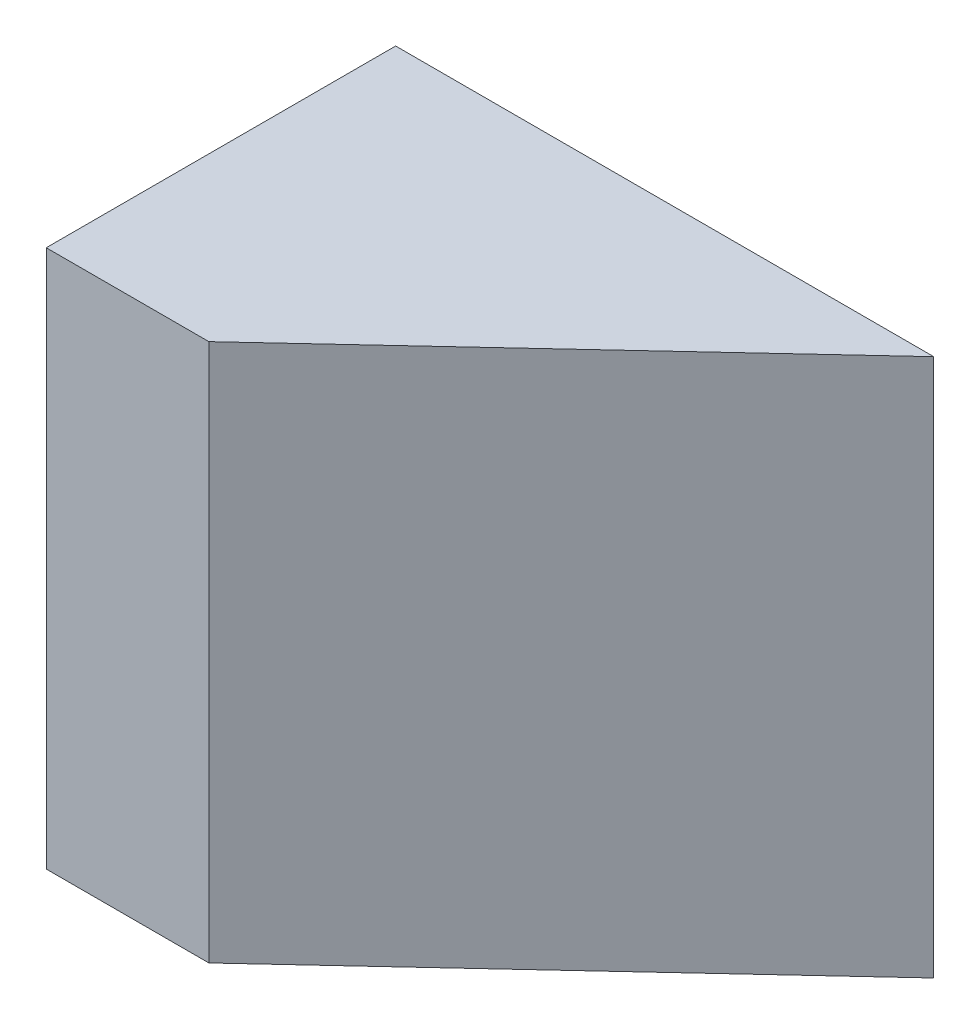
ISO-10303-21;
HEADER;
FILE_DESCRIPTION(('STEP AP214'),'2;1');
FILE_NAME('part.step','',(''),(''),'','','');
FILE_SCHEMA(('AUTOMOTIVE_DESIGN { 1 0 10303 214 1 1 1 1 }'));
ENDSEC;
DATA;
#1=APPLICATION_CONTEXT('core data for automotive mechanical design processes');
#2=APPLICATION_PROTOCOL_DEFINITION('international standard','automotive_design',2000,#1);
#3=PRODUCT_CONTEXT('',#1,'mechanical');
#4=PRODUCT('Part','Part','',(#3));
#5=PRODUCT_RELATED_PRODUCT_CATEGORY('part','',(#4));
#6=PRODUCT_DEFINITION_FORMATION('','',#4);
#7=PRODUCT_DEFINITION_CONTEXT('part definition',#1,'design');
#8=PRODUCT_DEFINITION('design','',#6,#7);
#9=PRODUCT_DEFINITION_SHAPE('','',#8);
#10=(LENGTH_UNIT() NAMED_UNIT(*) SI_UNIT(.MILLI.,.METRE.));
#11=(NAMED_UNIT(*) PLANE_ANGLE_UNIT() SI_UNIT($,.RADIAN.));
#12=(NAMED_UNIT(*) SI_UNIT($,.STERADIAN.) SOLID_ANGLE_UNIT());
#13=UNCERTAINTY_MEASURE_WITH_UNIT(LENGTH_MEASURE(1.E-05),#10,'distance_accuracy_value','');
#14=(GEOMETRIC_REPRESENTATION_CONTEXT(3) GLOBAL_UNCERTAINTY_ASSIGNED_CONTEXT((#13)) GLOBAL_UNIT_ASSIGNED_CONTEXT((#10,
#11,#12)) REPRESENTATION_CONTEXT('',''));
#15=CARTESIAN_POINT('',(0.,0.,0.));
#16=DIRECTION('',(0.,0.,1.));
#17=DIRECTION('',(1.,0.,0.));
#18=AXIS2_PLACEMENT_3D('',#15,#16,#17);
#19=CARTESIAN_POINT('',(0.,0.,0.));
#20=DIRECTION('',(0.,0.,-1.));
#21=DIRECTION('',(-1.,0.,0.));
#22=AXIS2_PLACEMENT_3D('',#19,#20,#21);
#23=PLANE('',#22);
#24=DIRECTION('',(0.,1.,0.));
#25=VECTOR('',#24,1.);
#26=CARTESIAN_POINT('',(77.,-77.,0.));
#27=LINE('',#26,#25);
#28=CARTESIAN_POINT('',(77.,-77.,0.));
#29=VERTEX_POINT('',#28);
#30=CARTESIAN_POINT('',(77.,77.,0.));
#31=VERTEX_POINT('',#30);
#32=EDGE_CURVE('E81',#29,#31,#27,.T.);
#33=ORIENTED_EDGE('',*,*,#32,.F.);
#34=DIRECTION('',(1.,0.,0.));
#35=VECTOR('',#34,1.);
#36=CARTESIAN_POINT('',(-77.,-77.,0.));
#37=LINE('',#36,#35);
#38=CARTESIAN_POINT('',(-77.,-77.,0.));
#39=VERTEX_POINT('',#38);
#40=EDGE_CURVE('E93',#39,#29,#37,.T.);
#41=ORIENTED_EDGE('',*,*,#40,.F.);
#42=DIRECTION('',(0.,-1.,0.));
#43=VECTOR('',#42,1.);
#44=CARTESIAN_POINT('',(-77.,-77.,0.));
#45=LINE('',#44,#43);
#46=CARTESIAN_POINT('',(-77.,77.,0.));
#47=VERTEX_POINT('',#46);
#48=EDGE_CURVE('E98',#47,#39,#45,.T.);
#49=ORIENTED_EDGE('',*,*,#48,.F.);
#50=DIRECTION('',(-1.,0.,0.));
#51=VECTOR('',#50,1.);
#52=CARTESIAN_POINT('',(-77.,77.,0.));
#53=LINE('',#52,#51);
#54=EDGE_CURVE('E102',#31,#47,#53,.T.);
#55=ORIENTED_EDGE('',*,*,#54,.F.);
#56=EDGE_LOOP('',(#33,#41,#49,#55));
#57=FACE_BOUND('',#56,.T.);
#58=DIRECTION('',(1.,0.,0.));
#59=VECTOR('',#58,1.);
#60=CARTESIAN_POINT('',(0.,-74.,0.));
#61=LINE('',#60,#59);
#62=CARTESIAN_POINT('',(-74.,-74.,0.));
#63=VERTEX_POINT('',#62);
#64=CARTESIAN_POINT('',(72.5963,-74.,0.));
#65=VERTEX_POINT('',#64);
#66=EDGE_CURVE('E114',#63,#65,#61,.T.);
#67=ORIENTED_EDGE('',*,*,#66,.T.);
#68=DIRECTION('',(0.,1.,0.));
#69=VECTOR('',#68,1.);
#70=CARTESIAN_POINT('',(72.5963,0.,0.));
#71=LINE('',#70,#69);
#72=CARTESIAN_POINT('',(72.5963,74.,0.));
#73=VERTEX_POINT('',#72);
#74=EDGE_CURVE('E119',#65,#73,#71,.T.);
#75=ORIENTED_EDGE('',*,*,#74,.T.);
#76=DIRECTION('',(-1.,0.,0.));
#77=VECTOR('',#76,1.);
#78=CARTESIAN_POINT('',(0.,74.,0.));
#79=LINE('',#78,#77);
#80=CARTESIAN_POINT('',(-74.,74.,0.));
#81=VERTEX_POINT('',#80);
#82=EDGE_CURVE('E115',#73,#81,#79,.T.);
#83=ORIENTED_EDGE('',*,*,#82,.T.);
#84=DIRECTION('',(0.,-1.,0.));
#85=VECTOR('',#84,1.);
#86=CARTESIAN_POINT('',(-74.,0.,0.));
#87=LINE('',#86,#85);
#88=EDGE_CURVE('E50',#81,#63,#87,.T.);
#89=ORIENTED_EDGE('',*,*,#88,.T.);
#90=EDGE_LOOP('',(#67,#75,#83,#89));
#91=FACE_BOUND('',#90,.T.);
#92=ADVANCED_FACE('F35',(#57,#91),#23,.T.);
#93=CARTESIAN_POINT('',(-77.,77.,100.));
#94=DIRECTION('',(0.,-1.,0.));
#95=DIRECTION('',(0.,0.,-1.));
#96=AXIS2_PLACEMENT_3D('',#93,#94,#95);
#97=PLANE('',#96);
#98=DIRECTION('',(-1.,0.,0.));
#99=VECTOR('',#98,1.);
#100=CARTESIAN_POINT('',(-77.,77.,100.));
#101=LINE('',#100,#99);
#102=CARTESIAN_POINT('',(-30.4583831071359,77.,100.));
#103=VERTEX_POINT('',#102);
#104=CARTESIAN_POINT('',(-77.,77.,100.));
#105=VERTEX_POINT('',#104);
#106=EDGE_CURVE('E97',#103,#105,#101,.T.);
#107=ORIENTED_EDGE('',*,*,#106,.F.);
#108=DIRECTION('',(0.73205520203785,0.,-0.68124531643845));
#109=VECTOR('',#108,1.);
#110=CARTESIAN_POINT('',(-30.4583831071359,77.,100.));
#111=LINE('',#110,#109);
#112=EDGE_CURVE('E88',#103,#31,#111,.T.);
#113=ORIENTED_EDGE('',*,*,#112,.T.);
#114=ORIENTED_EDGE('',*,*,#54,.T.);
#115=DIRECTION('',(0.,0.,-1.));
#116=VECTOR('',#115,1.);
#117=CARTESIAN_POINT('',(-77.,77.,100.));
#118=LINE('',#117,#116);
#119=EDGE_CURVE('E11',#105,#47,#118,.T.);
#120=ORIENTED_EDGE('',*,*,#119,.F.);
#121=EDGE_LOOP('',(#107,#113,#114,#120));
#122=FACE_BOUND('',#121,.T.);
#123=ADVANCED_FACE('F37',(#122),#97,.F.);
#124=CARTESIAN_POINT('',(-77.,-77.,100.));
#125=DIRECTION('',(1.,0.,0.));
#126=DIRECTION('',(0.,0.,-1.));
#127=AXIS2_PLACEMENT_3D('',#124,#125,#126);
#128=PLANE('',#127);
#129=ORIENTED_EDGE('',*,*,#48,.T.);
#130=DIRECTION('',(0.,0.,-1.));
#131=VECTOR('',#130,1.);
#132=CARTESIAN_POINT('',(-77.,-77.,100.));
#133=LINE('',#132,#131);
#134=CARTESIAN_POINT('',(-77.,-77.,100.));
#135=VERTEX_POINT('',#134);
#136=EDGE_CURVE('E43',#135,#39,#133,.T.);
#137=ORIENTED_EDGE('',*,*,#136,.F.);
#138=DIRECTION('',(0.,-1.,0.));
#139=VECTOR('',#138,1.);
#140=CARTESIAN_POINT('',(-77.,-77.,100.));
#141=LINE('',#140,#139);
#142=EDGE_CURVE('E59',#105,#135,#141,.T.);
#143=ORIENTED_EDGE('',*,*,#142,.F.);
#144=ORIENTED_EDGE('',*,*,#119,.T.);
#145=EDGE_LOOP('',(#129,#137,#143,#144));
#146=FACE_BOUND('',#145,.T.);
#147=ADVANCED_FACE('F182',(#146),#128,.F.);
#148=CARTESIAN_POINT('',(-77.,-77.,100.));
#149=DIRECTION('',(0.,1.,0.));
#150=DIRECTION('',(0.,0.,1.));
#151=AXIS2_PLACEMENT_3D('',#148,#149,#150);
#152=PLANE('',#151);
#153=ORIENTED_EDGE('',*,*,#40,.T.);
#154=DIRECTION('',(0.73205520203785,0.,-0.68124531643845));
#155=VECTOR('',#154,1.);
#156=CARTESIAN_POINT('',(-30.4583831071359,-77.,100.));
#157=LINE('',#156,#155);
#158=CARTESIAN_POINT('',(-30.4583831071359,-77.,100.));
#159=VERTEX_POINT('',#158);
#160=EDGE_CURVE('E76',#159,#29,#157,.T.);
#161=ORIENTED_EDGE('',*,*,#160,.F.);
#162=DIRECTION('',(1.,0.,0.));
#163=VECTOR('',#162,1.);
#164=CARTESIAN_POINT('',(-77.,-77.,100.));
#165=LINE('',#164,#163);
#166=EDGE_CURVE('E107',#135,#159,#165,.T.);
#167=ORIENTED_EDGE('',*,*,#166,.F.);
#168=ORIENTED_EDGE('',*,*,#136,.T.);
#169=EDGE_LOOP('',(#153,#161,#167,#168));
#170=FACE_BOUND('',#169,.T.);
#171=ADVANCED_FACE('F94',(#170),#152,.F.);
#172=CARTESIAN_POINT('',(0.,0.,100.));
#173=DIRECTION('',(0.,0.,-1.));
#174=DIRECTION('',(-1.,0.,0.));
#175=AXIS2_PLACEMENT_3D('',#172,#173,#174);
#176=PLANE('',#175);
#177=ORIENTED_EDGE('',*,*,#166,.T.);
#178=DIRECTION('',(0.,-1.,0.));
#179=VECTOR('',#178,1.);
#180=CARTESIAN_POINT('',(-30.4583831071359,77.,100.));
#181=LINE('',#180,#179);
#182=EDGE_CURVE('E85',#103,#159,#181,.T.);
#183=ORIENTED_EDGE('',*,*,#182,.F.);
#184=ORIENTED_EDGE('',*,*,#106,.T.);
#185=ORIENTED_EDGE('',*,*,#142,.T.);
#186=EDGE_LOOP('',(#177,#183,#184,#185));
#187=FACE_BOUND('',#186,.T.);
#188=ADVANCED_FACE('F179',(#187),#176,.F.);
#189=CARTESIAN_POINT('',(-30.4583831071359,77.,100.));
#190=DIRECTION('',(-0.68124531643845,0.,-0.73205520203785));
#191=DIRECTION('',(-0.73205520203785,0.,0.68124531643845));
#192=AXIS2_PLACEMENT_3D('',#189,#190,#191);
#193=PLANE('',#192);
#194=ORIENTED_EDGE('',*,*,#160,.T.);
#195=ORIENTED_EDGE('',*,*,#32,.T.);
#196=ORIENTED_EDGE('',*,*,#112,.F.);
#197=ORIENTED_EDGE('',*,*,#182,.T.);
#198=EDGE_LOOP('',(#194,#195,#196,#197));
#199=FACE_BOUND('',#198,.T.);
#200=ADVANCED_FACE('F78',(#199),#193,.F.);
#201=CARTESIAN_POINT('',(-77.,74.,100.));
#202=DIRECTION('',(0.,-1.,0.));
#203=DIRECTION('',(0.,0.,-1.));
#204=AXIS2_PLACEMENT_3D('',#201,#202,#203);
#205=PLANE('',#204);
#206=DIRECTION('',(-1.,0.,0.));
#207=VECTOR('',#206,1.);
#208=CARTESIAN_POINT('',(0.,74.,97.));
#209=LINE('',#208,#207);
#210=CARTESIAN_POINT('',(-31.6383316139218,74.,97.));
#211=VERTEX_POINT('',#210);
#212=CARTESIAN_POINT('',(-74.,74.,97.));
#213=VERTEX_POINT('',#212);
#214=EDGE_CURVE('E118',#211,#213,#209,.T.);
#215=ORIENTED_EDGE('',*,*,#214,.T.);
#216=DIRECTION('',(0.,0.,-1.));
#217=VECTOR('',#216,1.);
#218=CARTESIAN_POINT('',(-74.,74.,100.));
#219=LINE('',#218,#217);
#220=EDGE_CURVE('E89',#213,#81,#219,.T.);
#221=ORIENTED_EDGE('',*,*,#220,.T.);
#222=ORIENTED_EDGE('',*,*,#82,.F.);
#223=DIRECTION('',(0.73205520203785,0.,-0.68124531643845));
#224=VECTOR('',#223,1.);
#225=CARTESIAN_POINT('',(-57.4439958255084,74.,121.014565886273));
#226=LINE('',#225,#224);
#227=EDGE_CURVE('E127',#211,#73,#226,.T.);
#228=ORIENTED_EDGE('',*,*,#227,.F.);
#229=EDGE_LOOP('',(#215,#221,#222,#228));
#230=FACE_BOUND('',#229,.T.);
#231=ADVANCED_FACE('F147',(#230),#205,.T.);
#232=CARTESIAN_POINT('',(-74.,-77.,100.));
#233=DIRECTION('',(1.,0.,0.));
#234=DIRECTION('',(0.,0.,-1.));
#235=AXIS2_PLACEMENT_3D('',#232,#233,#234);
#236=PLANE('',#235);
#237=ORIENTED_EDGE('',*,*,#88,.F.);
#238=ORIENTED_EDGE('',*,*,#220,.F.);
#239=DIRECTION('',(0.,-1.,0.));
#240=VECTOR('',#239,1.);
#241=CARTESIAN_POINT('',(-74.,0.,97.));
#242=LINE('',#241,#240);
#243=CARTESIAN_POINT('',(-74.,-74.,97.));
#244=VERTEX_POINT('',#243);
#245=EDGE_CURVE('E132',#213,#244,#242,.T.);
#246=ORIENTED_EDGE('',*,*,#245,.T.);
#247=DIRECTION('',(0.,0.,-1.));
#248=VECTOR('',#247,1.);
#249=CARTESIAN_POINT('',(-74.,-74.,100.));
#250=LINE('',#249,#248);
#251=EDGE_CURVE('E131',#244,#63,#250,.T.);
#252=ORIENTED_EDGE('',*,*,#251,.T.);
#253=EDGE_LOOP('',(#237,#238,#246,#252));
#254=FACE_BOUND('',#253,.T.);
#255=ADVANCED_FACE('F156',(#254),#236,.T.);
#256=CARTESIAN_POINT('',(-77.,-74.,100.));
#257=DIRECTION('',(0.,1.,0.));
#258=DIRECTION('',(0.,0.,1.));
#259=AXIS2_PLACEMENT_3D('',#256,#257,#258);
#260=PLANE('',#259);
#261=ORIENTED_EDGE('',*,*,#66,.F.);
#262=ORIENTED_EDGE('',*,*,#251,.F.);
#263=DIRECTION('',(1.,0.,0.));
#264=VECTOR('',#263,1.);
#265=CARTESIAN_POINT('',(0.,-74.,97.));
#266=LINE('',#265,#264);
#267=CARTESIAN_POINT('',(-31.6383316139218,-74.,97.));
#268=VERTEX_POINT('',#267);
#269=EDGE_CURVE('E128',#244,#268,#266,.T.);
#270=ORIENTED_EDGE('',*,*,#269,.T.);
#271=DIRECTION('',(0.73205520203785,0.,-0.68124531643845));
#272=VECTOR('',#271,1.);
#273=CARTESIAN_POINT('',(-32.5021190564513,-74.,97.8038343938865));
#274=LINE('',#273,#272);
#275=EDGE_CURVE('E133',#268,#65,#274,.T.);
#276=ORIENTED_EDGE('',*,*,#275,.T.);
#277=EDGE_LOOP('',(#261,#262,#270,#276));
#278=FACE_BOUND('',#277,.T.);
#279=ADVANCED_FACE('F165',(#278),#260,.T.);
#280=CARTESIAN_POINT('',(0.,0.,97.));
#281=DIRECTION('',(0.,0.,-1.));
#282=DIRECTION('',(-1.,0.,0.));
#283=AXIS2_PLACEMENT_3D('',#280,#281,#282);
#284=PLANE('',#283);
#285=ORIENTED_EDGE('',*,*,#269,.F.);
#286=ORIENTED_EDGE('',*,*,#245,.F.);
#287=ORIENTED_EDGE('',*,*,#214,.F.);
#288=DIRECTION('',(0.,-1.,0.));
#289=VECTOR('',#288,1.);
#290=CARTESIAN_POINT('',(-31.6383316139218,77.,97.));
#291=LINE('',#290,#289);
#292=EDGE_CURVE('E122',#211,#268,#291,.T.);
#293=ORIENTED_EDGE('',*,*,#292,.T.);
#294=EDGE_LOOP('',(#285,#286,#287,#293));
#295=FACE_BOUND('',#294,.T.);
#296=ADVANCED_FACE('F159',(#295),#284,.T.);
#297=CARTESIAN_POINT('',(-32.5021190564513,77.,97.8038343938865));
#298=DIRECTION('',(-0.68124531643845,0.,-0.73205520203785));
#299=DIRECTION('',(-0.73205520203785,0.,0.68124531643845));
#300=AXIS2_PLACEMENT_3D('',#297,#298,#299);
#301=PLANE('',#300);
#302=ORIENTED_EDGE('',*,*,#275,.F.);
#303=ORIENTED_EDGE('',*,*,#292,.F.);
#304=ORIENTED_EDGE('',*,*,#227,.T.);
#305=ORIENTED_EDGE('',*,*,#74,.F.);
#306=EDGE_LOOP('',(#302,#303,#304,#305));
#307=FACE_BOUND('',#306,.T.);
#308=ADVANCED_FACE('F198',(#307),#301,.T.);
#309=CLOSED_SHELL('',(#92,#123,#147,#171,#188,#200,#231,#255,#279,#296,#308));
#310=MANIFOLD_SOLID_BREP('B2',#309);
#311=ADVANCED_BREP_SHAPE_REPRESENTATION('',(#18,#310),#14);
#312=SHAPE_DEFINITION_REPRESENTATION(#9,#311);
ENDSEC;
END-ISO-10303-21;
